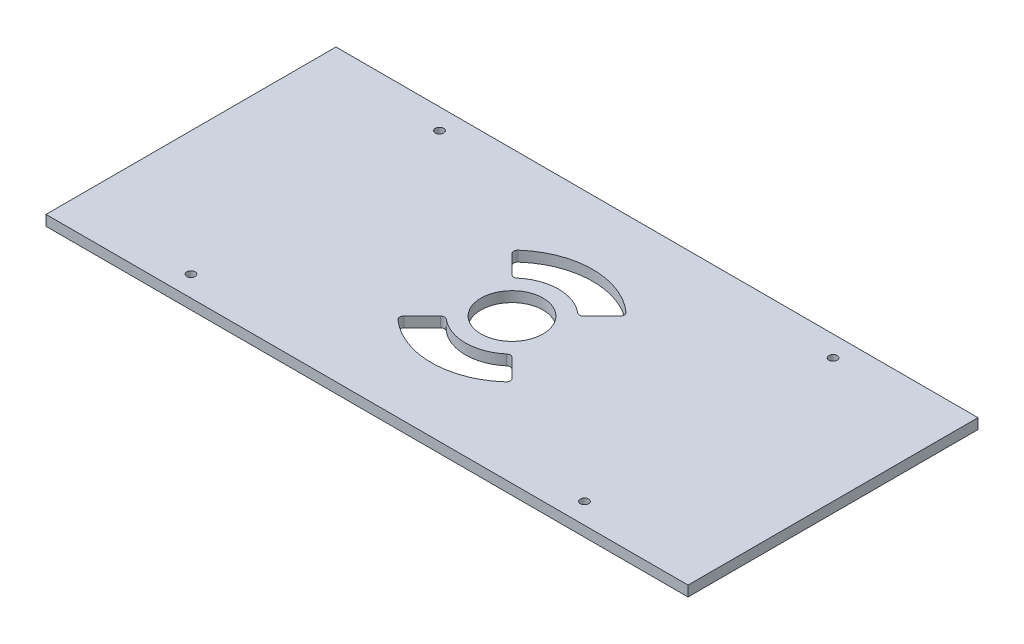
ISO-10303-21;
HEADER;
FILE_DESCRIPTION(('STEP AP214'),'2;1');
FILE_NAME('part.step','',(''),(''),'','','');
FILE_SCHEMA(('AUTOMOTIVE_DESIGN { 1 0 10303 214 1 1 1 1 }'));
ENDSEC;
DATA;
#1=APPLICATION_CONTEXT('core data for automotive mechanical design processes');
#2=APPLICATION_PROTOCOL_DEFINITION('international standard','automotive_design',2000,#1);
#3=PRODUCT_CONTEXT('',#1,'mechanical');
#4=PRODUCT('Part','Part','',(#3));
#5=PRODUCT_RELATED_PRODUCT_CATEGORY('part','',(#4));
#6=PRODUCT_DEFINITION_FORMATION('','',#4);
#7=PRODUCT_DEFINITION_CONTEXT('part definition',#1,'design');
#8=PRODUCT_DEFINITION('design','',#6,#7);
#9=PRODUCT_DEFINITION_SHAPE('','',#8);
#10=(LENGTH_UNIT() NAMED_UNIT(*) SI_UNIT(.MILLI.,.METRE.));
#11=(NAMED_UNIT(*) PLANE_ANGLE_UNIT() SI_UNIT($,.RADIAN.));
#12=(NAMED_UNIT(*) SI_UNIT($,.STERADIAN.) SOLID_ANGLE_UNIT());
#13=UNCERTAINTY_MEASURE_WITH_UNIT(LENGTH_MEASURE(1.E-05),#10,'distance_accuracy_value','');
#14=(GEOMETRIC_REPRESENTATION_CONTEXT(3) GLOBAL_UNCERTAINTY_ASSIGNED_CONTEXT((#13)) GLOBAL_UNIT_ASSIGNED_CONTEXT((#10,
#11,#12)) REPRESENTATION_CONTEXT('',''));
#15=CARTESIAN_POINT('',(0.,0.,0.));
#16=DIRECTION('',(0.,0.,1.));
#17=DIRECTION('',(1.,0.,0.));
#18=AXIS2_PLACEMENT_3D('',#15,#16,#17);
#19=CARTESIAN_POINT('',(0.,5.,0.));
#20=DIRECTION('',(0.,1.,0.));
#21=DIRECTION('',(0.,0.,1.));
#22=AXIS2_PLACEMENT_3D('',#19,#20,#21);
#23=PLANE('',#22);
#24=CARTESIAN_POINT('',(-95.,5.,60.));
#25=DIRECTION('',(0.,1.,0.));
#26=DIRECTION('',(0.,0.,-1.));
#27=AXIS2_PLACEMENT_3D('',#24,#25,#26);
#28=CIRCLE('',#27,2.);
#29=CARTESIAN_POINT('',(-95.,5.,58.));
#30=VERTEX_POINT('',#29);
#31=EDGE_CURVE('E407',#30,#30,#28,.T.);
#32=ORIENTED_EDGE('',*,*,#31,.F.);
#33=EDGE_LOOP('',(#32));
#34=FACE_BOUND('',#33,.T.);
#35=CARTESIAN_POINT('',(95.,5.,60.));
#36=DIRECTION('',(0.,1.,0.));
#37=DIRECTION('',(0.,0.,1.));
#38=AXIS2_PLACEMENT_3D('',#35,#36,#37);
#39=CIRCLE('',#38,2.);
#40=CARTESIAN_POINT('',(95.,5.,62.));
#41=VERTEX_POINT('',#40);
#42=EDGE_CURVE('E399',#41,#41,#39,.T.);
#43=ORIENTED_EDGE('',*,*,#42,.F.);
#44=EDGE_LOOP('',(#43));
#45=FACE_BOUND('',#44,.T.);
#46=CARTESIAN_POINT('',(95.,5.,-60.));
#47=DIRECTION('',(0.,1.,0.));
#48=DIRECTION('',(0.,0.,-1.));
#49=AXIS2_PLACEMENT_3D('',#46,#47,#48);
#50=CIRCLE('',#49,2.);
#51=CARTESIAN_POINT('',(95.,5.,-62.));
#52=VERTEX_POINT('',#51);
#53=EDGE_CURVE('E391',#52,#52,#50,.T.);
#54=ORIENTED_EDGE('',*,*,#53,.F.);
#55=EDGE_LOOP('',(#54));
#56=FACE_BOUND('',#55,.T.);
#57=CARTESIAN_POINT('',(-95.,5.,-60.));
#58=DIRECTION('',(0.,1.,0.));
#59=DIRECTION('',(0.,0.,1.));
#60=AXIS2_PLACEMENT_3D('',#57,#58,#59);
#61=CIRCLE('',#60,2.);
#62=CARTESIAN_POINT('',(-95.,5.,-58.));
#63=VERTEX_POINT('',#62);
#64=EDGE_CURVE('E390',#63,#63,#61,.T.);
#65=ORIENTED_EDGE('',*,*,#64,.F.);
#66=EDGE_LOOP('',(#65));
#67=FACE_BOUND('',#66,.T.);
#68=CARTESIAN_POINT('',(0.,5.,0.));
#69=DIRECTION('',(0.,1.,0.));
#70=DIRECTION('',(0.,0.,1.));
#71=AXIS2_PLACEMENT_3D('',#68,#69,#70);
#72=CIRCLE('',#71,15.);
#73=CARTESIAN_POINT('',(0.,5.,15.));
#74=VERTEX_POINT('',#73);
#75=EDGE_CURVE('E416',#74,#74,#72,.T.);
#76=ORIENTED_EDGE('',*,*,#75,.F.);
#77=EDGE_LOOP('',(#76));
#78=FACE_BOUND('',#77,.T.);
#79=DIRECTION('',(0.,0.,-1.));
#80=VECTOR('',#79,1.);
#81=CARTESIAN_POINT('',(155.,5.,-70.));
#82=LINE('',#81,#80);
#83=CARTESIAN_POINT('',(155.,5.,70.));
#84=VERTEX_POINT('',#83);
#85=CARTESIAN_POINT('',(155.,5.,-70.));
#86=VERTEX_POINT('',#85);
#87=EDGE_CURVE('E189',#84,#86,#82,.T.);
#88=ORIENTED_EDGE('',*,*,#87,.T.);
#89=DIRECTION('',(-1.,0.,0.));
#90=VECTOR('',#89,1.);
#91=CARTESIAN_POINT('',(-155.,5.,-70.));
#92=LINE('',#91,#90);
#93=CARTESIAN_POINT('',(-155.,5.,-70.));
#94=VERTEX_POINT('',#93);
#95=EDGE_CURVE('E177',#86,#94,#92,.T.);
#96=ORIENTED_EDGE('',*,*,#95,.T.);
#97=DIRECTION('',(0.,0.,1.));
#98=VECTOR('',#97,1.);
#99=CARTESIAN_POINT('',(-155.,5.,-70.));
#100=LINE('',#99,#98);
#101=CARTESIAN_POINT('',(-155.,5.,70.));
#102=VERTEX_POINT('',#101);
#103=EDGE_CURVE('E188',#94,#102,#100,.T.);
#104=ORIENTED_EDGE('',*,*,#103,.T.);
#105=DIRECTION('',(1.,0.,0.));
#106=VECTOR('',#105,1.);
#107=CARTESIAN_POINT('',(-155.,5.,70.));
#108=LINE('',#107,#106);
#109=EDGE_CURVE('E194',#102,#84,#108,.T.);
#110=ORIENTED_EDGE('',*,*,#109,.T.);
#111=EDGE_LOOP('',(#88,#96,#104,#110));
#112=FACE_BOUND('',#111,.T.);
#113=DIRECTION('',(0.707106781186546,0.,-0.707106781186549));
#114=VECTOR('',#113,1.);
#115=CARTESIAN_POINT('',(0.,5.,0.));
#116=LINE('',#115,#114);
#117=CARTESIAN_POINT('',(17.266296649832,5.,-17.266296649832));
#118=VERTEX_POINT('',#117);
#119=CARTESIAN_POINT('',(26.1247009552262,5.,-26.1247009552263));
#120=VERTEX_POINT('',#119);
#121=EDGE_CURVE('E354',#118,#120,#116,.T.);
#122=ORIENTED_EDGE('',*,*,#121,.F.);
#123=CARTESIAN_POINT('',(15.8520830874589,5.,-18.6805102122051));
#124=DIRECTION('',(0.,1.,0.));
#125=DIRECTION('',(0.,0.,1.));
#126=AXIS2_PLACEMENT_3D('',#123,#124,#125);
#127=CIRCLE('',#126,2.);
#128=CARTESIAN_POINT('',(14.5580354884826,5.,-17.1555706030455));
#129=VERTEX_POINT('',#128);
#130=EDGE_CURVE('E333',#118,#129,#127,.F.);
#131=ORIENTED_EDGE('',*,*,#130,.T.);
#132=CARTESIAN_POINT('',(0.,5.,0.));
#133=DIRECTION('',(0.,1.,0.));
#134=DIRECTION('',(0.,0.,1.));
#135=AXIS2_PLACEMENT_3D('',#132,#133,#134);
#136=CIRCLE('',#135,22.5);
#137=CARTESIAN_POINT('',(-14.5580354884825,5.,-17.1555706030456));
#138=VERTEX_POINT('',#137);
#139=EDGE_CURVE('E372',#129,#138,#136,.T.);
#140=ORIENTED_EDGE('',*,*,#139,.T.);
#141=CARTESIAN_POINT('',(-15.8520830874588,5.,-18.6805102122052));
#142=DIRECTION('',(0.,1.,0.));
#143=DIRECTION('',(0.,0.,1.));
#144=AXIS2_PLACEMENT_3D('',#141,#142,#143);
#145=CIRCLE('',#144,2.);
#146=CARTESIAN_POINT('',(-17.2662966498319,5.,-17.2662966498322));
#147=VERTEX_POINT('',#146);
#148=EDGE_CURVE('E321',#138,#147,#145,.F.);
#149=ORIENTED_EDGE('',*,*,#148,.T.);
#150=DIRECTION('',(-0.707106781186542,0.,-0.707106781186553));
#151=VECTOR('',#150,1.);
#152=CARTESIAN_POINT('',(0.,5.,0.));
#153=LINE('',#152,#151);
#154=CARTESIAN_POINT('',(-26.1247009552261,5.,-26.1247009552265));
#155=VERTEX_POINT('',#154);
#156=EDGE_CURVE('E345',#147,#155,#153,.T.);
#157=ORIENTED_EDGE('',*,*,#156,.T.);
#158=CARTESIAN_POINT('',(-24.7104873928529,5.,-27.5389145175996));
#159=DIRECTION('',(0.,1.,0.));
#160=DIRECTION('',(0.,0.,1.));
#161=AXIS2_PLACEMENT_3D('',#158,#159,#160);
#162=CIRCLE('',#161,2.);
#163=CARTESIAN_POINT('',(-26.0461894140882,5.,-29.0275044915239));
#164=VERTEX_POINT('',#163);
#165=EDGE_CURVE('E47',#155,#164,#162,.F.);
#166=ORIENTED_EDGE('',*,*,#165,.T.);
#167=CARTESIAN_POINT('',(0.,5.,0.));
#168=DIRECTION('',(0.,1.,0.));
#169=DIRECTION('',(0.,0.,1.));
#170=AXIS2_PLACEMENT_3D('',#167,#168,#169);
#171=CIRCLE('',#170,39.);
#172=CARTESIAN_POINT('',(26.0461894140884,5.,-29.0275044915237));
#173=VERTEX_POINT('',#172);
#174=EDGE_CURVE('E343',#173,#164,#171,.T.);
#175=ORIENTED_EDGE('',*,*,#174,.F.);
#176=CARTESIAN_POINT('',(24.7104873928531,5.,-27.5389145175994));
#177=DIRECTION('',(0.,1.,0.));
#178=DIRECTION('',(0.,0.,1.));
#179=AXIS2_PLACEMENT_3D('',#176,#177,#178);
#180=CIRCLE('',#179,2.);
#181=EDGE_CURVE('E327',#173,#120,#180,.F.);
#182=ORIENTED_EDGE('',*,*,#181,.T.);
#183=EDGE_LOOP('',(#122,#131,#140,#149,#157,#166,#175,#182));
#184=FACE_BOUND('',#183,.T.);
#185=DIRECTION('',(-0.707106781186551,0.,0.707106781186544));
#186=VECTOR('',#185,1.);
#187=CARTESIAN_POINT('',(0.,5.,0.));
#188=LINE('',#187,#186);
#189=CARTESIAN_POINT('',(-17.2662966498321,5.,17.2662966498319));
#190=VERTEX_POINT('',#189);
#191=CARTESIAN_POINT('',(-26.1247009552264,5.,26.1247009552261));
#192=VERTEX_POINT('',#191);
#193=EDGE_CURVE('E541',#190,#192,#188,.T.);
#194=ORIENTED_EDGE('',*,*,#193,.F.);
#195=CARTESIAN_POINT('',(-15.852083087459,5.,18.680510212205));
#196=DIRECTION('',(0.,1.,0.));
#197=DIRECTION('',(0.,0.,1.));
#198=AXIS2_PLACEMENT_3D('',#195,#196,#197);
#199=CIRCLE('',#198,2.);
#200=CARTESIAN_POINT('',(-14.5580354884828,5.,17.1555706030454));
#201=VERTEX_POINT('',#200);
#202=EDGE_CURVE('E315',#190,#201,#199,.F.);
#203=ORIENTED_EDGE('',*,*,#202,.T.);
#204=CARTESIAN_POINT('',(0.,5.,0.));
#205=DIRECTION('',(0.,1.,0.));
#206=DIRECTION('',(0.,0.,1.));
#207=AXIS2_PLACEMENT_3D('',#204,#205,#206);
#208=CIRCLE('',#207,22.5);
#209=CARTESIAN_POINT('',(14.5580354884826,5.,17.1555706030455));
#210=VERTEX_POINT('',#209);
#211=EDGE_CURVE('E385',#201,#210,#208,.T.);
#212=ORIENTED_EDGE('',*,*,#211,.T.);
#213=CARTESIAN_POINT('',(15.8520830874589,5.,18.6805102122051));
#214=DIRECTION('',(0.,1.,0.));
#215=DIRECTION('',(0.,0.,1.));
#216=AXIS2_PLACEMENT_3D('',#213,#214,#215);
#217=CIRCLE('',#216,2.);
#218=CARTESIAN_POINT('',(17.266296649832,5.,17.266296649832));
#219=VERTEX_POINT('',#218);
#220=EDGE_CURVE('E297',#210,#219,#217,.F.);
#221=ORIENTED_EDGE('',*,*,#220,.T.);
#222=DIRECTION('',(0.707106781186546,0.,0.707106781186549));
#223=VECTOR('',#222,1.);
#224=CARTESIAN_POINT('',(0.,5.,0.));
#225=LINE('',#224,#223);
#226=CARTESIAN_POINT('',(26.1247009552262,5.,26.1247009552263));
#227=VERTEX_POINT('',#226);
#228=EDGE_CURVE('E411',#219,#227,#225,.T.);
#229=ORIENTED_EDGE('',*,*,#228,.T.);
#230=CARTESIAN_POINT('',(24.7104873928531,5.,27.5389145175994));
#231=DIRECTION('',(0.,1.,0.));
#232=DIRECTION('',(0.,0.,1.));
#233=AXIS2_PLACEMENT_3D('',#230,#231,#232);
#234=CIRCLE('',#233,2.);
#235=CARTESIAN_POINT('',(26.0461894140884,5.,29.0275044915237));
#236=VERTEX_POINT('',#235);
#237=EDGE_CURVE('E303',#227,#236,#234,.F.);
#238=ORIENTED_EDGE('',*,*,#237,.T.);
#239=CARTESIAN_POINT('',(0.,5.,0.));
#240=DIRECTION('',(0.,1.,0.));
#241=DIRECTION('',(0.,0.,1.));
#242=AXIS2_PLACEMENT_3D('',#239,#240,#241);
#243=CIRCLE('',#242,39.);
#244=CARTESIAN_POINT('',(-26.0461894140886,5.,29.0275044915235));
#245=VERTEX_POINT('',#244);
#246=EDGE_CURVE('E524',#245,#236,#243,.T.);
#247=ORIENTED_EDGE('',*,*,#246,.F.);
#248=CARTESIAN_POINT('',(-24.7104873928533,5.,27.5389145175992));
#249=DIRECTION('',(0.,1.,0.));
#250=DIRECTION('',(0.,0.,1.));
#251=AXIS2_PLACEMENT_3D('',#248,#249,#250);
#252=CIRCLE('',#251,2.);
#253=EDGE_CURVE('E309',#245,#192,#252,.F.);
#254=ORIENTED_EDGE('',*,*,#253,.T.);
#255=EDGE_LOOP('',(#194,#203,#212,#221,#229,#238,#247,#254));
#256=FACE_BOUND('',#255,.T.);
#257=ADVANCED_FACE('F38',(#34,#45,#56,#67,#78,#112,#184,#256),#23,.T.);
#258=CARTESIAN_POINT('',(0.,0.,0.));
#259=DIRECTION('',(0.,1.,0.));
#260=DIRECTION('',(0.,0.,1.));
#261=AXIS2_PLACEMENT_3D('',#258,#259,#260);
#262=PLANE('',#261);
#263=CARTESIAN_POINT('',(0.,0.,0.));
#264=DIRECTION('',(0.,1.,0.));
#265=DIRECTION('',(0.,0.,1.));
#266=AXIS2_PLACEMENT_3D('',#263,#264,#265);
#267=CIRCLE('',#266,22.5);
#268=CARTESIAN_POINT('',(14.5580354884826,0.,-17.1555706030455));
#269=VERTEX_POINT('',#268);
#270=CARTESIAN_POINT('',(-14.5580354884825,0.,-17.1555706030456));
#271=VERTEX_POINT('',#270);
#272=EDGE_CURVE('E222',#269,#271,#267,.T.);
#273=ORIENTED_EDGE('',*,*,#272,.F.);
#274=CARTESIAN_POINT('',(15.8520830874589,0.,-18.6805102122051));
#275=DIRECTION('',(0.,1.,0.));
#276=DIRECTION('',(0.,0.,1.));
#277=AXIS2_PLACEMENT_3D('',#274,#275,#276);
#278=CIRCLE('',#277,2.);
#279=CARTESIAN_POINT('',(17.266296649832,0.,-17.266296649832));
#280=VERTEX_POINT('',#279);
#281=EDGE_CURVE('E61',#269,#280,#278,.T.);
#282=ORIENTED_EDGE('',*,*,#281,.T.);
#283=DIRECTION('',(0.707106781186546,0.,-0.707106781186549));
#284=VECTOR('',#283,1.);
#285=CARTESIAN_POINT('',(0.,0.,0.));
#286=LINE('',#285,#284);
#287=CARTESIAN_POINT('',(26.1247009552262,0.,-26.1247009552263));
#288=VERTEX_POINT('',#287);
#289=EDGE_CURVE('E205',#280,#288,#286,.T.);
#290=ORIENTED_EDGE('',*,*,#289,.T.);
#291=CARTESIAN_POINT('',(24.7104873928531,0.,-27.5389145175994));
#292=DIRECTION('',(0.,1.,0.));
#293=DIRECTION('',(0.,0.,1.));
#294=AXIS2_PLACEMENT_3D('',#291,#292,#293);
#295=CIRCLE('',#294,2.);
#296=CARTESIAN_POINT('',(26.0461894140884,0.,-29.0275044915237));
#297=VERTEX_POINT('',#296);
#298=EDGE_CURVE('E330',#288,#297,#295,.T.);
#299=ORIENTED_EDGE('',*,*,#298,.T.);
#300=CARTESIAN_POINT('',(0.,0.,0.));
#301=DIRECTION('',(0.,1.,0.));
#302=DIRECTION('',(0.,0.,1.));
#303=AXIS2_PLACEMENT_3D('',#300,#301,#302);
#304=CIRCLE('',#303,39.);
#305=CARTESIAN_POINT('',(-26.0461894140882,0.,-29.0275044915239));
#306=VERTEX_POINT('',#305);
#307=EDGE_CURVE('E209',#297,#306,#304,.T.);
#308=ORIENTED_EDGE('',*,*,#307,.T.);
#309=CARTESIAN_POINT('',(-24.7104873928529,0.,-27.5389145175996));
#310=DIRECTION('',(0.,1.,0.));
#311=DIRECTION('',(0.,0.,1.));
#312=AXIS2_PLACEMENT_3D('',#309,#310,#311);
#313=CIRCLE('',#312,2.);
#314=CARTESIAN_POINT('',(-26.1247009552261,0.,-26.1247009552265));
#315=VERTEX_POINT('',#314);
#316=EDGE_CURVE('E11',#306,#315,#313,.T.);
#317=ORIENTED_EDGE('',*,*,#316,.T.);
#318=DIRECTION('',(-0.707106781186542,0.,-0.707106781186553));
#319=VECTOR('',#318,1.);
#320=CARTESIAN_POINT('',(0.,0.,0.));
#321=LINE('',#320,#319);
#322=CARTESIAN_POINT('',(-17.2662966498319,0.,-17.2662966498322));
#323=VERTEX_POINT('',#322);
#324=EDGE_CURVE('E218',#323,#315,#321,.T.);
#325=ORIENTED_EDGE('',*,*,#324,.F.);
#326=CARTESIAN_POINT('',(-15.8520830874588,0.,-18.6805102122052));
#327=DIRECTION('',(0.,1.,0.));
#328=DIRECTION('',(0.,0.,1.));
#329=AXIS2_PLACEMENT_3D('',#326,#327,#328);
#330=CIRCLE('',#329,2.);
#331=EDGE_CURVE('E324',#323,#271,#330,.T.);
#332=ORIENTED_EDGE('',*,*,#331,.T.);
#333=EDGE_LOOP('',(#273,#282,#290,#299,#308,#317,#325,#332));
#334=FACE_BOUND('',#333,.T.);
#335=CARTESIAN_POINT('',(-95.,0.,60.));
#336=DIRECTION('',(0.,1.,0.));
#337=DIRECTION('',(0.,0.,-1.));
#338=AXIS2_PLACEMENT_3D('',#335,#336,#337);
#339=CIRCLE('',#338,2.);
#340=CARTESIAN_POINT('',(-95.,0.,58.));
#341=VERTEX_POINT('',#340);
#342=EDGE_CURVE('E403',#341,#341,#339,.T.);
#343=ORIENTED_EDGE('',*,*,#342,.T.);
#344=EDGE_LOOP('',(#343));
#345=FACE_BOUND('',#344,.T.);
#346=CARTESIAN_POINT('',(95.,0.,60.));
#347=DIRECTION('',(0.,1.,0.));
#348=DIRECTION('',(0.,0.,1.));
#349=AXIS2_PLACEMENT_3D('',#346,#347,#348);
#350=CIRCLE('',#349,2.);
#351=CARTESIAN_POINT('',(95.,0.,62.));
#352=VERTEX_POINT('',#351);
#353=EDGE_CURVE('E395',#352,#352,#350,.T.);
#354=ORIENTED_EDGE('',*,*,#353,.T.);
#355=EDGE_LOOP('',(#354));
#356=FACE_BOUND('',#355,.T.);
#357=CARTESIAN_POINT('',(95.,0.,-60.));
#358=DIRECTION('',(0.,1.,0.));
#359=DIRECTION('',(0.,0.,-1.));
#360=AXIS2_PLACEMENT_3D('',#357,#358,#359);
#361=CIRCLE('',#360,2.);
#362=CARTESIAN_POINT('',(95.,0.,-62.));
#363=VERTEX_POINT('',#362);
#364=EDGE_CURVE('E386',#363,#363,#361,.T.);
#365=ORIENTED_EDGE('',*,*,#364,.T.);
#366=EDGE_LOOP('',(#365));
#367=FACE_BOUND('',#366,.T.);
#368=CARTESIAN_POINT('',(-95.,0.,-60.));
#369=DIRECTION('',(0.,1.,0.));
#370=DIRECTION('',(0.,0.,1.));
#371=AXIS2_PLACEMENT_3D('',#368,#369,#370);
#372=CIRCLE('',#371,2.);
#373=CARTESIAN_POINT('',(-95.,0.,-58.));
#374=VERTEX_POINT('',#373);
#375=EDGE_CURVE('E412',#374,#374,#372,.T.);
#376=ORIENTED_EDGE('',*,*,#375,.T.);
#377=EDGE_LOOP('',(#376));
#378=FACE_BOUND('',#377,.T.);
#379=CARTESIAN_POINT('',(0.,0.,0.));
#380=DIRECTION('',(0.,1.,0.));
#381=DIRECTION('',(0.,0.,1.));
#382=AXIS2_PLACEMENT_3D('',#379,#380,#381);
#383=CIRCLE('',#382,15.);
#384=CARTESIAN_POINT('',(0.,0.,15.));
#385=VERTEX_POINT('',#384);
#386=EDGE_CURVE('E420',#385,#385,#383,.T.);
#387=ORIENTED_EDGE('',*,*,#386,.T.);
#388=EDGE_LOOP('',(#387));
#389=FACE_BOUND('',#388,.T.);
#390=DIRECTION('',(0.,0.,-1.));
#391=VECTOR('',#390,1.);
#392=CARTESIAN_POINT('',(155.,0.,-70.));
#393=LINE('',#392,#391);
#394=CARTESIAN_POINT('',(155.,0.,70.));
#395=VERTEX_POINT('',#394);
#396=CARTESIAN_POINT('',(155.,0.,-70.));
#397=VERTEX_POINT('',#396);
#398=EDGE_CURVE('E203',#395,#397,#393,.T.);
#399=ORIENTED_EDGE('',*,*,#398,.F.);
#400=DIRECTION('',(1.,0.,0.));
#401=VECTOR('',#400,1.);
#402=CARTESIAN_POINT('',(-155.,0.,70.));
#403=LINE('',#402,#401);
#404=CARTESIAN_POINT('',(-155.,0.,70.));
#405=VERTEX_POINT('',#404);
#406=EDGE_CURVE('E199',#405,#395,#403,.T.);
#407=ORIENTED_EDGE('',*,*,#406,.F.);
#408=DIRECTION('',(0.,0.,1.));
#409=VECTOR('',#408,1.);
#410=CARTESIAN_POINT('',(-155.,0.,-70.));
#411=LINE('',#410,#409);
#412=CARTESIAN_POINT('',(-155.,0.,-70.));
#413=VERTEX_POINT('',#412);
#414=EDGE_CURVE('E437',#413,#405,#411,.T.);
#415=ORIENTED_EDGE('',*,*,#414,.F.);
#416=DIRECTION('',(-1.,0.,0.));
#417=VECTOR('',#416,1.);
#418=CARTESIAN_POINT('',(-155.,0.,-70.));
#419=LINE('',#418,#417);
#420=EDGE_CURVE('E434',#397,#413,#419,.T.);
#421=ORIENTED_EDGE('',*,*,#420,.F.);
#422=EDGE_LOOP('',(#399,#407,#415,#421));
#423=FACE_BOUND('',#422,.T.);
#424=CARTESIAN_POINT('',(0.,0.,0.));
#425=DIRECTION('',(0.,1.,0.));
#426=DIRECTION('',(0.,0.,1.));
#427=AXIS2_PLACEMENT_3D('',#424,#425,#426);
#428=CIRCLE('',#427,22.5);
#429=CARTESIAN_POINT('',(-14.5580354884828,0.,17.1555706030454));
#430=VERTEX_POINT('',#429);
#431=CARTESIAN_POINT('',(14.5580354884826,0.,17.1555706030455));
#432=VERTEX_POINT('',#431);
#433=EDGE_CURVE('E238',#430,#432,#428,.T.);
#434=ORIENTED_EDGE('',*,*,#433,.F.);
#435=CARTESIAN_POINT('',(-15.852083087459,0.,18.680510212205));
#436=DIRECTION('',(0.,1.,0.));
#437=DIRECTION('',(0.,0.,1.));
#438=AXIS2_PLACEMENT_3D('',#435,#436,#437);
#439=CIRCLE('',#438,2.);
#440=CARTESIAN_POINT('',(-17.2662966498321,0.,17.2662966498319));
#441=VERTEX_POINT('',#440);
#442=EDGE_CURVE('E318',#430,#441,#439,.T.);
#443=ORIENTED_EDGE('',*,*,#442,.T.);
#444=DIRECTION('',(-0.707106781186551,0.,0.707106781186544));
#445=VECTOR('',#444,1.);
#446=CARTESIAN_POINT('',(0.,0.,0.));
#447=LINE('',#446,#445);
#448=CARTESIAN_POINT('',(-26.1247009552264,0.,26.1247009552261));
#449=VERTEX_POINT('',#448);
#450=EDGE_CURVE('E226',#441,#449,#447,.T.);
#451=ORIENTED_EDGE('',*,*,#450,.T.);
#452=CARTESIAN_POINT('',(-24.7104873928533,0.,27.5389145175992));
#453=DIRECTION('',(0.,1.,0.));
#454=DIRECTION('',(0.,0.,1.));
#455=AXIS2_PLACEMENT_3D('',#452,#453,#454);
#456=CIRCLE('',#455,2.);
#457=CARTESIAN_POINT('',(-26.0461894140886,0.,29.0275044915235));
#458=VERTEX_POINT('',#457);
#459=EDGE_CURVE('E312',#449,#458,#456,.T.);
#460=ORIENTED_EDGE('',*,*,#459,.T.);
#461=CARTESIAN_POINT('',(0.,0.,0.));
#462=DIRECTION('',(0.,1.,0.));
#463=DIRECTION('',(0.,0.,1.));
#464=AXIS2_PLACEMENT_3D('',#461,#462,#463);
#465=CIRCLE('',#464,39.);
#466=CARTESIAN_POINT('',(26.0461894140884,0.,29.0275044915237));
#467=VERTEX_POINT('',#466);
#468=EDGE_CURVE('E230',#458,#467,#465,.T.);
#469=ORIENTED_EDGE('',*,*,#468,.T.);
#470=CARTESIAN_POINT('',(24.7104873928531,0.,27.5389145175994));
#471=DIRECTION('',(0.,1.,0.));
#472=DIRECTION('',(0.,0.,1.));
#473=AXIS2_PLACEMENT_3D('',#470,#471,#472);
#474=CIRCLE('',#473,2.);
#475=CARTESIAN_POINT('',(26.1247009552262,0.,26.1247009552263));
#476=VERTEX_POINT('',#475);
#477=EDGE_CURVE('E306',#467,#476,#474,.T.);
#478=ORIENTED_EDGE('',*,*,#477,.T.);
#479=DIRECTION('',(0.707106781186546,0.,0.707106781186549));
#480=VECTOR('',#479,1.);
#481=CARTESIAN_POINT('',(0.,0.,0.));
#482=LINE('',#481,#480);
#483=CARTESIAN_POINT('',(17.266296649832,0.,17.266296649832));
#484=VERTEX_POINT('',#483);
#485=EDGE_CURVE('E234',#484,#476,#482,.T.);
#486=ORIENTED_EDGE('',*,*,#485,.F.);
#487=CARTESIAN_POINT('',(15.8520830874589,0.,18.6805102122051));
#488=DIRECTION('',(0.,1.,0.));
#489=DIRECTION('',(0.,0.,1.));
#490=AXIS2_PLACEMENT_3D('',#487,#488,#489);
#491=CIRCLE('',#490,2.);
#492=EDGE_CURVE('E300',#484,#432,#491,.T.);
#493=ORIENTED_EDGE('',*,*,#492,.T.);
#494=EDGE_LOOP('',(#434,#443,#451,#460,#469,#478,#486,#493));
#495=FACE_BOUND('',#494,.T.);
#496=ADVANCED_FACE('F358',(#334,#345,#356,#367,#378,#389,#423,#495),#262,.F.);
#497=CARTESIAN_POINT('',(155.,5.,-70.));
#498=DIRECTION('',(-1.,0.,0.));
#499=DIRECTION('',(0.,0.,1.));
#500=AXIS2_PLACEMENT_3D('',#497,#498,#499);
#501=PLANE('',#500);
#502=ORIENTED_EDGE('',*,*,#398,.T.);
#503=DIRECTION('',(0.,-1.,0.));
#504=VECTOR('',#503,1.);
#505=CARTESIAN_POINT('',(155.,5.,-70.));
#506=LINE('',#505,#504);
#507=EDGE_CURVE('E181',#86,#397,#506,.T.);
#508=ORIENTED_EDGE('',*,*,#507,.F.);
#509=ORIENTED_EDGE('',*,*,#87,.F.);
#510=DIRECTION('',(0.,-1.,0.));
#511=VECTOR('',#510,1.);
#512=CARTESIAN_POINT('',(155.,5.,70.));
#513=LINE('',#512,#511);
#514=EDGE_CURVE('E431',#84,#395,#513,.T.);
#515=ORIENTED_EDGE('',*,*,#514,.T.);
#516=EDGE_LOOP('',(#502,#508,#509,#515));
#517=FACE_BOUND('',#516,.T.);
#518=ADVANCED_FACE('F201',(#517),#501,.F.);
#519=CARTESIAN_POINT('',(-155.,5.,-70.));
#520=DIRECTION('',(0.,0.,1.));
#521=DIRECTION('',(1.,0.,0.));
#522=AXIS2_PLACEMENT_3D('',#519,#520,#521);
#523=PLANE('',#522);
#524=ORIENTED_EDGE('',*,*,#420,.T.);
#525=DIRECTION('',(0.,-1.,0.));
#526=VECTOR('',#525,1.);
#527=CARTESIAN_POINT('',(-155.,5.,-70.));
#528=LINE('',#527,#526);
#529=EDGE_CURVE('E184',#94,#413,#528,.T.);
#530=ORIENTED_EDGE('',*,*,#529,.F.);
#531=ORIENTED_EDGE('',*,*,#95,.F.);
#532=ORIENTED_EDGE('',*,*,#507,.T.);
#533=EDGE_LOOP('',(#524,#530,#531,#532));
#534=FACE_BOUND('',#533,.T.);
#535=ADVANCED_FACE('F179',(#534),#523,.F.);
#536=CARTESIAN_POINT('',(-155.,5.,-70.));
#537=DIRECTION('',(1.,0.,0.));
#538=DIRECTION('',(0.,0.,-1.));
#539=AXIS2_PLACEMENT_3D('',#536,#537,#538);
#540=PLANE('',#539);
#541=ORIENTED_EDGE('',*,*,#414,.T.);
#542=DIRECTION('',(0.,-1.,0.));
#543=VECTOR('',#542,1.);
#544=CARTESIAN_POINT('',(-155.,5.,70.));
#545=LINE('',#544,#543);
#546=EDGE_CURVE('E211',#102,#405,#545,.T.);
#547=ORIENTED_EDGE('',*,*,#546,.F.);
#548=ORIENTED_EDGE('',*,*,#103,.F.);
#549=ORIENTED_EDGE('',*,*,#529,.T.);
#550=EDGE_LOOP('',(#541,#547,#548,#549));
#551=FACE_BOUND('',#550,.T.);
#552=ADVANCED_FACE('F453',(#551),#540,.F.);
#553=CARTESIAN_POINT('',(-155.,5.,70.));
#554=DIRECTION('',(0.,0.,-1.));
#555=DIRECTION('',(-1.,0.,0.));
#556=AXIS2_PLACEMENT_3D('',#553,#554,#555);
#557=PLANE('',#556);
#558=ORIENTED_EDGE('',*,*,#406,.T.);
#559=ORIENTED_EDGE('',*,*,#514,.F.);
#560=ORIENTED_EDGE('',*,*,#109,.F.);
#561=ORIENTED_EDGE('',*,*,#546,.T.);
#562=EDGE_LOOP('',(#558,#559,#560,#561));
#563=FACE_BOUND('',#562,.T.);
#564=ADVANCED_FACE('F448',(#563),#557,.F.);
#565=CARTESIAN_POINT('',(0.,0.,0.));
#566=DIRECTION('',(0.,1.,0.));
#567=DIRECTION('',(0.,0.,1.));
#568=AXIS2_PLACEMENT_3D('',#565,#566,#567);
#569=CYLINDRICAL_SURFACE('',#568,15.);
#570=ORIENTED_EDGE('',*,*,#386,.F.);
#571=EDGE_LOOP('',(#570));
#572=FACE_BOUND('',#571,.T.);
#573=ORIENTED_EDGE('',*,*,#75,.T.);
#574=EDGE_LOOP('',(#573));
#575=FACE_BOUND('',#574,.T.);
#576=ADVANCED_FACE('F460',(#572,#575),#569,.F.);
#577=CARTESIAN_POINT('',(-95.,0.,-60.));
#578=DIRECTION('',(0.,1.,0.));
#579=DIRECTION('',(0.,0.,1.));
#580=AXIS2_PLACEMENT_3D('',#577,#578,#579);
#581=CYLINDRICAL_SURFACE('',#580,2.);
#582=ORIENTED_EDGE('',*,*,#375,.F.);
#583=EDGE_LOOP('',(#582));
#584=FACE_BOUND('',#583,.T.);
#585=ORIENTED_EDGE('',*,*,#64,.T.);
#586=EDGE_LOOP('',(#585));
#587=FACE_BOUND('',#586,.T.);
#588=ADVANCED_FACE('F475',(#584,#587),#581,.F.);
#589=CARTESIAN_POINT('',(95.,0.,-60.));
#590=DIRECTION('',(0.,1.,0.));
#591=DIRECTION('',(0.,0.,1.));
#592=AXIS2_PLACEMENT_3D('',#589,#590,#591);
#593=CYLINDRICAL_SURFACE('',#592,2.);
#594=ORIENTED_EDGE('',*,*,#364,.F.);
#595=EDGE_LOOP('',(#594));
#596=FACE_BOUND('',#595,.T.);
#597=ORIENTED_EDGE('',*,*,#53,.T.);
#598=EDGE_LOOP('',(#597));
#599=FACE_BOUND('',#598,.T.);
#600=ADVANCED_FACE('F479',(#596,#599),#593,.F.);
#601=CARTESIAN_POINT('',(95.,0.,60.));
#602=DIRECTION('',(0.,1.,0.));
#603=DIRECTION('',(0.,0.,1.));
#604=AXIS2_PLACEMENT_3D('',#601,#602,#603);
#605=CYLINDRICAL_SURFACE('',#604,2.);
#606=ORIENTED_EDGE('',*,*,#353,.F.);
#607=EDGE_LOOP('',(#606));
#608=FACE_BOUND('',#607,.T.);
#609=ORIENTED_EDGE('',*,*,#42,.T.);
#610=EDGE_LOOP('',(#609));
#611=FACE_BOUND('',#610,.T.);
#612=ADVANCED_FACE('F484',(#608,#611),#605,.F.);
#613=CARTESIAN_POINT('',(-95.,0.,60.));
#614=DIRECTION('',(0.,1.,0.));
#615=DIRECTION('',(0.,0.,1.));
#616=AXIS2_PLACEMENT_3D('',#613,#614,#615);
#617=CYLINDRICAL_SURFACE('',#616,2.);
#618=ORIENTED_EDGE('',*,*,#342,.F.);
#619=EDGE_LOOP('',(#618));
#620=FACE_BOUND('',#619,.T.);
#621=ORIENTED_EDGE('',*,*,#31,.T.);
#622=EDGE_LOOP('',(#621));
#623=FACE_BOUND('',#622,.T.);
#624=ADVANCED_FACE('F481',(#620,#623),#617,.F.);
#625=CARTESIAN_POINT('',(0.,-5.,0.));
#626=DIRECTION('',(0.,1.,0.));
#627=DIRECTION('',(0.,0.,1.));
#628=AXIS2_PLACEMENT_3D('',#625,#626,#627);
#629=CYLINDRICAL_SURFACE('',#628,22.5);
#630=ORIENTED_EDGE('',*,*,#272,.T.);
#631=DIRECTION('',(0.,1.,0.));
#632=VECTOR('',#631,1.);
#633=CARTESIAN_POINT('',(-14.5580354884825,-5.,-17.1555706030456));
#634=LINE('',#633,#632);
#635=EDGE_CURVE('E273',#271,#138,#634,.T.);
#636=ORIENTED_EDGE('',*,*,#635,.T.);
#637=ORIENTED_EDGE('',*,*,#139,.F.);
#638=DIRECTION('',(0.,1.,0.));
#639=VECTOR('',#638,1.);
#640=CARTESIAN_POINT('',(14.5580354884826,-5.,-17.1555706030455));
#641=LINE('',#640,#639);
#642=EDGE_CURVE('E270',#129,#269,#641,.F.);
#643=ORIENTED_EDGE('',*,*,#642,.T.);
#644=EDGE_LOOP('',(#630,#636,#637,#643));
#645=FACE_BOUND('',#644,.T.);
#646=ADVANCED_FACE('F368',(#645),#629,.T.);
#647=CARTESIAN_POINT('',(0.,-5.,0.));
#648=DIRECTION('',(0.707106781186553,0.,-0.707106781186542));
#649=DIRECTION('',(-0.707106781186542,0.,-0.707106781186553));
#650=AXIS2_PLACEMENT_3D('',#647,#648,#649);
#651=PLANE('',#650);
#652=ORIENTED_EDGE('',*,*,#156,.F.);
#653=DIRECTION('',(0.,-1.,0.));
#654=VECTOR('',#653,1.);
#655=CARTESIAN_POINT('',(-17.2662966498319,0.,-17.2662966498322));
#656=LINE('',#655,#654);
#657=EDGE_CURVE('E281',#147,#323,#656,.T.);
#658=ORIENTED_EDGE('',*,*,#657,.T.);
#659=ORIENTED_EDGE('',*,*,#324,.T.);
#660=DIRECTION('',(0.,1.,0.));
#661=VECTOR('',#660,1.);
#662=CARTESIAN_POINT('',(-26.124700955226,-5.,-26.1247009552265));
#663=LINE('',#662,#661);
#664=EDGE_CURVE('E277',#315,#155,#663,.T.);
#665=ORIENTED_EDGE('',*,*,#664,.T.);
#666=EDGE_LOOP('',(#652,#658,#659,#665));
#667=FACE_BOUND('',#666,.T.);
#668=ADVANCED_FACE('F362',(#667),#651,.T.);
#669=CARTESIAN_POINT('',(0.,-5.,0.));
#670=DIRECTION('',(0.,1.,0.));
#671=DIRECTION('',(0.,0.,1.));
#672=AXIS2_PLACEMENT_3D('',#669,#670,#671);
#673=CYLINDRICAL_SURFACE('',#672,39.);
#674=ORIENTED_EDGE('',*,*,#307,.F.);
#675=DIRECTION('',(0.,1.,0.));
#676=VECTOR('',#675,1.);
#677=CARTESIAN_POINT('',(26.0461894140884,-5.,-29.0275044915237));
#678=LINE('',#677,#676);
#679=EDGE_CURVE('E287',#297,#173,#678,.T.);
#680=ORIENTED_EDGE('',*,*,#679,.T.);
#681=ORIENTED_EDGE('',*,*,#174,.T.);
#682=DIRECTION('',(0.,1.,0.));
#683=VECTOR('',#682,1.);
#684=CARTESIAN_POINT('',(-26.0461894140882,-5.,-29.0275044915239));
#685=LINE('',#684,#683);
#686=EDGE_CURVE('E284',#164,#306,#685,.F.);
#687=ORIENTED_EDGE('',*,*,#686,.T.);
#688=EDGE_LOOP('',(#674,#680,#681,#687));
#689=FACE_BOUND('',#688,.T.);
#690=ADVANCED_FACE('F351',(#689),#673,.F.);
#691=CARTESIAN_POINT('',(0.,-5.,0.));
#692=DIRECTION('',(0.707106781186549,0.,0.707106781186546));
#693=DIRECTION('',(0.707106781186546,0.,-0.707106781186549));
#694=AXIS2_PLACEMENT_3D('',#691,#692,#693);
#695=PLANE('',#694);
#696=ORIENTED_EDGE('',*,*,#121,.T.);
#697=DIRECTION('',(0.,-1.,0.));
#698=VECTOR('',#697,1.);
#699=CARTESIAN_POINT('',(26.1247009552262,0.,-26.1247009552263));
#700=LINE('',#699,#698);
#701=EDGE_CURVE('E54',#120,#288,#700,.T.);
#702=ORIENTED_EDGE('',*,*,#701,.T.);
#703=ORIENTED_EDGE('',*,*,#289,.F.);
#704=DIRECTION('',(0.,1.,0.));
#705=VECTOR('',#704,1.);
#706=CARTESIAN_POINT('',(17.266296649832,-5.,-17.266296649832));
#707=LINE('',#706,#705);
#708=EDGE_CURVE('E291',#280,#118,#707,.T.);
#709=ORIENTED_EDGE('',*,*,#708,.T.);
#710=EDGE_LOOP('',(#696,#702,#703,#709));
#711=FACE_BOUND('',#710,.T.);
#712=ADVANCED_FACE('F376',(#711),#695,.F.);
#713=CARTESIAN_POINT('',(0.,-5.,0.));
#714=DIRECTION('',(0.,1.,0.));
#715=DIRECTION('',(0.,0.,1.));
#716=AXIS2_PLACEMENT_3D('',#713,#714,#715);
#717=CYLINDRICAL_SURFACE('',#716,22.5);
#718=ORIENTED_EDGE('',*,*,#433,.T.);
#719=DIRECTION('',(0.,1.,0.));
#720=VECTOR('',#719,1.);
#721=CARTESIAN_POINT('',(14.5580354884827,-5.,17.1555706030455));
#722=LINE('',#721,#720);
#723=EDGE_CURVE('E245',#432,#210,#722,.T.);
#724=ORIENTED_EDGE('',*,*,#723,.T.);
#725=ORIENTED_EDGE('',*,*,#211,.F.);
#726=DIRECTION('',(0.,1.,0.));
#727=VECTOR('',#726,1.);
#728=CARTESIAN_POINT('',(-14.5580354884828,-5.,17.1555706030454));
#729=LINE('',#728,#727);
#730=EDGE_CURVE('E242',#201,#430,#729,.F.);
#731=ORIENTED_EDGE('',*,*,#730,.T.);
#732=EDGE_LOOP('',(#718,#724,#725,#731));
#733=FACE_BOUND('',#732,.T.);
#734=ADVANCED_FACE('F496',(#733),#717,.T.);
#735=CARTESIAN_POINT('',(0.,-5.,0.));
#736=DIRECTION('',(-0.707106781186549,0.,0.707106781186546));
#737=DIRECTION('',(0.707106781186546,0.,0.707106781186549));
#738=AXIS2_PLACEMENT_3D('',#735,#736,#737);
#739=PLANE('',#738);
#740=ORIENTED_EDGE('',*,*,#228,.F.);
#741=DIRECTION('',(0.,-1.,0.));
#742=VECTOR('',#741,1.);
#743=CARTESIAN_POINT('',(17.266296649832,0.,17.266296649832));
#744=LINE('',#743,#742);
#745=EDGE_CURVE('E253',#219,#484,#744,.T.);
#746=ORIENTED_EDGE('',*,*,#745,.T.);
#747=ORIENTED_EDGE('',*,*,#485,.T.);
#748=DIRECTION('',(0.,1.,0.));
#749=VECTOR('',#748,1.);
#750=CARTESIAN_POINT('',(26.1247009552262,-5.,26.1247009552263));
#751=LINE('',#750,#749);
#752=EDGE_CURVE('E249',#476,#227,#751,.T.);
#753=ORIENTED_EDGE('',*,*,#752,.T.);
#754=EDGE_LOOP('',(#740,#746,#747,#753));
#755=FACE_BOUND('',#754,.T.);
#756=ADVANCED_FACE('F503',(#755),#739,.T.);
#757=CARTESIAN_POINT('',(0.,-5.,0.));
#758=DIRECTION('',(0.,1.,0.));
#759=DIRECTION('',(0.,0.,1.));
#760=AXIS2_PLACEMENT_3D('',#757,#758,#759);
#761=CYLINDRICAL_SURFACE('',#760,39.);
#762=ORIENTED_EDGE('',*,*,#246,.T.);
#763=DIRECTION('',(0.,1.,0.));
#764=VECTOR('',#763,1.);
#765=CARTESIAN_POINT('',(26.0461894140884,-5.,29.0275044915237));
#766=LINE('',#765,#764);
#767=EDGE_CURVE('E260',#236,#467,#766,.F.);
#768=ORIENTED_EDGE('',*,*,#767,.T.);
#769=ORIENTED_EDGE('',*,*,#468,.F.);
#770=DIRECTION('',(0.,1.,0.));
#771=VECTOR('',#770,1.);
#772=CARTESIAN_POINT('',(-26.0461894140886,-5.,29.0275044915235));
#773=LINE('',#772,#771);
#774=EDGE_CURVE('E256',#458,#245,#773,.T.);
#775=ORIENTED_EDGE('',*,*,#774,.T.);
#776=EDGE_LOOP('',(#762,#768,#769,#775));
#777=FACE_BOUND('',#776,.T.);
#778=ADVANCED_FACE('F509',(#777),#761,.F.);
#779=CARTESIAN_POINT('',(0.,-5.,0.));
#780=DIRECTION('',(-0.707106781186544,0.,-0.707106781186551));
#781=DIRECTION('',(-0.707106781186551,0.,0.707106781186544));
#782=AXIS2_PLACEMENT_3D('',#779,#780,#781);
#783=PLANE('',#782);
#784=ORIENTED_EDGE('',*,*,#193,.T.);
#785=DIRECTION('',(0.,-1.,0.));
#786=VECTOR('',#785,1.);
#787=CARTESIAN_POINT('',(-26.1247009552264,0.,26.1247009552261));
#788=LINE('',#787,#786);
#789=EDGE_CURVE('E267',#192,#449,#788,.T.);
#790=ORIENTED_EDGE('',*,*,#789,.T.);
#791=ORIENTED_EDGE('',*,*,#450,.F.);
#792=DIRECTION('',(0.,1.,0.));
#793=VECTOR('',#792,1.);
#794=CARTESIAN_POINT('',(-17.2662966498321,-5.,17.2662966498319));
#795=LINE('',#794,#793);
#796=EDGE_CURVE('E263',#441,#190,#795,.T.);
#797=ORIENTED_EDGE('',*,*,#796,.T.);
#798=EDGE_LOOP('',(#784,#790,#791,#797));
#799=FACE_BOUND('',#798,.T.);
#800=ADVANCED_FACE('F505',(#799),#783,.F.);
#801=CARTESIAN_POINT('',(15.8520830874589,-5.,18.6805102122051));
#802=DIRECTION('',(0.,1.,0.));
#803=DIRECTION('',(0.,0.,1.));
#804=AXIS2_PLACEMENT_3D('',#801,#802,#803);
#805=CYLINDRICAL_SURFACE('',#804,2.);
#806=ORIENTED_EDGE('',*,*,#492,.F.);
#807=ORIENTED_EDGE('',*,*,#745,.F.);
#808=ORIENTED_EDGE('',*,*,#220,.F.);
#809=ORIENTED_EDGE('',*,*,#723,.F.);
#810=EDGE_LOOP('',(#806,#807,#808,#809));
#811=FACE_BOUND('',#810,.T.);
#812=ADVANCED_FACE('F508',(#811),#805,.F.);
#813=CARTESIAN_POINT('',(24.7104873928531,-5.,27.5389145175994));
#814=DIRECTION('',(0.,1.,0.));
#815=DIRECTION('',(0.,0.,1.));
#816=AXIS2_PLACEMENT_3D('',#813,#814,#815);
#817=CYLINDRICAL_SURFACE('',#816,2.);
#818=ORIENTED_EDGE('',*,*,#477,.F.);
#819=ORIENTED_EDGE('',*,*,#767,.F.);
#820=ORIENTED_EDGE('',*,*,#237,.F.);
#821=ORIENTED_EDGE('',*,*,#752,.F.);
#822=EDGE_LOOP('',(#818,#819,#820,#821));
#823=FACE_BOUND('',#822,.T.);
#824=ADVANCED_FACE('F551',(#823),#817,.F.);
#825=CARTESIAN_POINT('',(-24.7104873928533,-5.,27.5389145175992));
#826=DIRECTION('',(0.,1.,0.));
#827=DIRECTION('',(0.,0.,1.));
#828=AXIS2_PLACEMENT_3D('',#825,#826,#827);
#829=CYLINDRICAL_SURFACE('',#828,2.);
#830=ORIENTED_EDGE('',*,*,#459,.F.);
#831=ORIENTED_EDGE('',*,*,#789,.F.);
#832=ORIENTED_EDGE('',*,*,#253,.F.);
#833=ORIENTED_EDGE('',*,*,#774,.F.);
#834=EDGE_LOOP('',(#830,#831,#832,#833));
#835=FACE_BOUND('',#834,.T.);
#836=ADVANCED_FACE('F543',(#835),#829,.F.);
#837=CARTESIAN_POINT('',(-15.852083087459,-5.,18.680510212205));
#838=DIRECTION('',(0.,1.,0.));
#839=DIRECTION('',(0.,0.,1.));
#840=AXIS2_PLACEMENT_3D('',#837,#838,#839);
#841=CYLINDRICAL_SURFACE('',#840,2.);
#842=ORIENTED_EDGE('',*,*,#442,.F.);
#843=ORIENTED_EDGE('',*,*,#730,.F.);
#844=ORIENTED_EDGE('',*,*,#202,.F.);
#845=ORIENTED_EDGE('',*,*,#796,.F.);
#846=EDGE_LOOP('',(#842,#843,#844,#845));
#847=FACE_BOUND('',#846,.T.);
#848=ADVANCED_FACE('F534',(#847),#841,.F.);
#849=CARTESIAN_POINT('',(-15.8520830874588,-5.,-18.6805102122052));
#850=DIRECTION('',(0.,1.,0.));
#851=DIRECTION('',(0.,0.,1.));
#852=AXIS2_PLACEMENT_3D('',#849,#850,#851);
#853=CYLINDRICAL_SURFACE('',#852,2.);
#854=ORIENTED_EDGE('',*,*,#331,.F.);
#855=ORIENTED_EDGE('',*,*,#657,.F.);
#856=ORIENTED_EDGE('',*,*,#148,.F.);
#857=ORIENTED_EDGE('',*,*,#635,.F.);
#858=EDGE_LOOP('',(#854,#855,#856,#857));
#859=FACE_BOUND('',#858,.T.);
#860=ADVANCED_FACE('F365',(#859),#853,.F.);
#861=CARTESIAN_POINT('',(24.7104873928531,-5.,-27.5389145175994));
#862=DIRECTION('',(0.,1.,0.));
#863=DIRECTION('',(0.,0.,1.));
#864=AXIS2_PLACEMENT_3D('',#861,#862,#863);
#865=CYLINDRICAL_SURFACE('',#864,2.);
#866=ORIENTED_EDGE('',*,*,#298,.F.);
#867=ORIENTED_EDGE('',*,*,#701,.F.);
#868=ORIENTED_EDGE('',*,*,#181,.F.);
#869=ORIENTED_EDGE('',*,*,#679,.F.);
#870=EDGE_LOOP('',(#866,#867,#868,#869));
#871=FACE_BOUND('',#870,.T.);
#872=ADVANCED_FACE('F572',(#871),#865,.F.);
#873=CARTESIAN_POINT('',(15.8520830874589,-5.,-18.6805102122051));
#874=DIRECTION('',(0.,1.,0.));
#875=DIRECTION('',(0.,0.,1.));
#876=AXIS2_PLACEMENT_3D('',#873,#874,#875);
#877=CYLINDRICAL_SURFACE('',#876,2.);
#878=ORIENTED_EDGE('',*,*,#281,.F.);
#879=ORIENTED_EDGE('',*,*,#642,.F.);
#880=ORIENTED_EDGE('',*,*,#130,.F.);
#881=ORIENTED_EDGE('',*,*,#708,.F.);
#882=EDGE_LOOP('',(#878,#879,#880,#881));
#883=FACE_BOUND('',#882,.T.);
#884=ADVANCED_FACE('F374',(#883),#877,.F.);
#885=CARTESIAN_POINT('',(-24.7104873928529,-5.,-27.5389145175996));
#886=DIRECTION('',(0.,1.,0.));
#887=DIRECTION('',(0.,0.,1.));
#888=AXIS2_PLACEMENT_3D('',#885,#886,#887);
#889=CYLINDRICAL_SURFACE('',#888,2.);
#890=ORIENTED_EDGE('',*,*,#316,.F.);
#891=ORIENTED_EDGE('',*,*,#686,.F.);
#892=ORIENTED_EDGE('',*,*,#165,.F.);
#893=ORIENTED_EDGE('',*,*,#664,.F.);
#894=EDGE_LOOP('',(#890,#891,#892,#893));
#895=FACE_BOUND('',#894,.T.);
#896=ADVANCED_FACE('F40',(#895),#889,.F.);
#897=CLOSED_SHELL('',(#257,#496,#518,#535,#552,#564,#576,#588,#600,#612,#624,#646,#668,#690,
#712,#734,#756,#778,#800,#812,#824,#836,#848,#860,#872,#884,#896));
#898=MANIFOLD_SOLID_BREP('B2',#897);
#899=ADVANCED_BREP_SHAPE_REPRESENTATION('',(#18,#898),#14);
#900=SHAPE_DEFINITION_REPRESENTATION(#9,#899);
ENDSEC;
END-ISO-10303-21;
